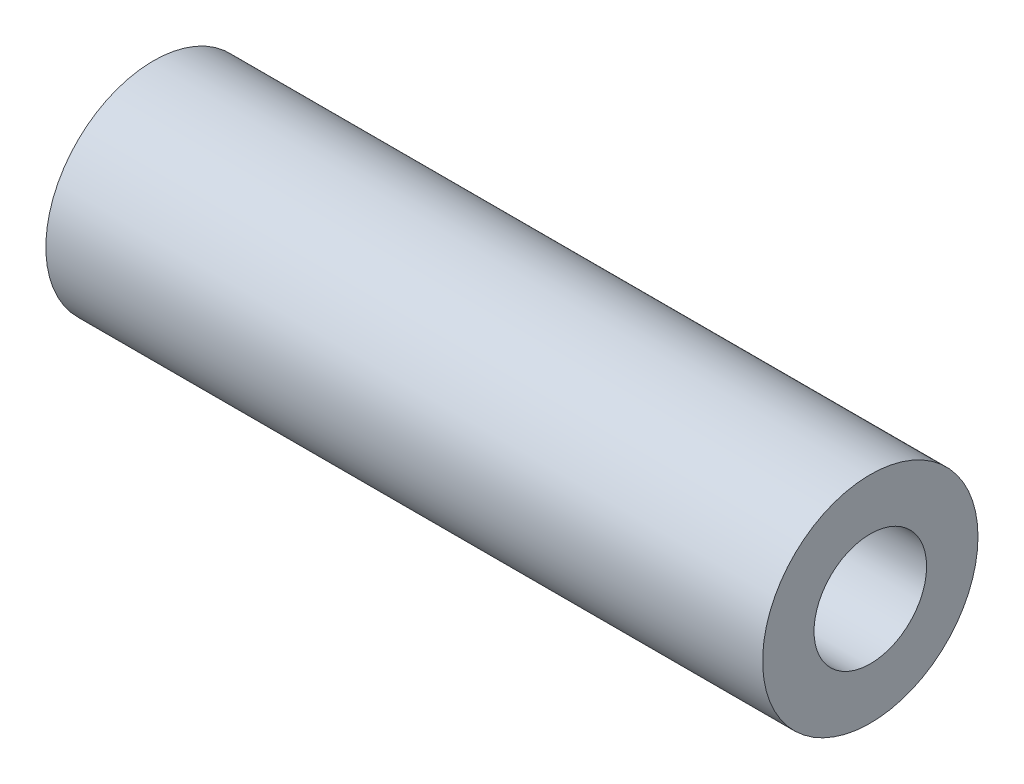
ISO-10303-21;
HEADER;
FILE_DESCRIPTION(('STEP AP214'),'2;1');
FILE_NAME('part.step','',(''),(''),'','','');
FILE_SCHEMA(('AUTOMOTIVE_DESIGN { 1 0 10303 214 1 1 1 1 }'));
ENDSEC;
DATA;
#1=APPLICATION_CONTEXT('core data for automotive mechanical design processes');
#2=APPLICATION_PROTOCOL_DEFINITION('international standard','automotive_design',2000,#1);
#3=PRODUCT_CONTEXT('',#1,'mechanical');
#4=PRODUCT('Part','Part','',(#3));
#5=PRODUCT_RELATED_PRODUCT_CATEGORY('part','',(#4));
#6=PRODUCT_DEFINITION_FORMATION('','',#4);
#7=PRODUCT_DEFINITION_CONTEXT('part definition',#1,'design');
#8=PRODUCT_DEFINITION('design','',#6,#7);
#9=PRODUCT_DEFINITION_SHAPE('','',#8);
#10=(LENGTH_UNIT() NAMED_UNIT(*) SI_UNIT(.MILLI.,.METRE.));
#11=(NAMED_UNIT(*) PLANE_ANGLE_UNIT() SI_UNIT($,.RADIAN.));
#12=(NAMED_UNIT(*) SI_UNIT($,.STERADIAN.) SOLID_ANGLE_UNIT());
#13=UNCERTAINTY_MEASURE_WITH_UNIT(LENGTH_MEASURE(1.E-05),#10,'distance_accuracy_value','');
#14=(GEOMETRIC_REPRESENTATION_CONTEXT(3) GLOBAL_UNCERTAINTY_ASSIGNED_CONTEXT((#13)) GLOBAL_UNIT_ASSIGNED_CONTEXT((#10,
#11,#12)) REPRESENTATION_CONTEXT('',''));
#15=CARTESIAN_POINT('',(0.,0.,0.));
#16=DIRECTION('',(0.,0.,1.));
#17=DIRECTION('',(1.,0.,0.));
#18=AXIS2_PLACEMENT_3D('',#15,#16,#17);
#19=CARTESIAN_POINT('',(15.8496,0.,0.));
#20=DIRECTION('',(1.,0.,0.));
#21=DIRECTION('',(0.,0.,-1.));
#22=AXIS2_PLACEMENT_3D('',#19,#20,#21);
#23=PLANE('',#22);
#24=CARTESIAN_POINT('',(15.8496,0.,0.));
#25=DIRECTION('',(1.,0.,0.));
#26=DIRECTION('',(0.,0.,-1.));
#27=AXIS2_PLACEMENT_3D('',#24,#25,#26);
#28=CIRCLE('',#27,4.7625);
#29=CARTESIAN_POINT('',(15.8496,0.,-4.7625));
#30=VERTEX_POINT('',#29);
#31=EDGE_CURVE('E10',#30,#30,#28,.T.);
#32=ORIENTED_EDGE('',*,*,#31,.T.);
#33=EDGE_LOOP('',(#32));
#34=FACE_BOUND('',#33,.T.);
#35=CARTESIAN_POINT('',(15.8496,0.,0.));
#36=DIRECTION('',(1.,0.,0.));
#37=DIRECTION('',(0.,0.,-1.));
#38=AXIS2_PLACEMENT_3D('',#35,#36,#37);
#39=CIRCLE('',#38,2.4892);
#40=CARTESIAN_POINT('',(15.8496,0.,-2.4892));
#41=VERTEX_POINT('',#40);
#42=EDGE_CURVE('E50',#41,#41,#39,.T.);
#43=ORIENTED_EDGE('',*,*,#42,.F.);
#44=EDGE_LOOP('',(#43));
#45=FACE_BOUND('',#44,.T.);
#46=ADVANCED_FACE('F39',(#34,#45),#23,.T.);
#47=CARTESIAN_POINT('',(-15.8496,0.,0.));
#48=DIRECTION('',(1.,0.,0.));
#49=DIRECTION('',(0.,0.,-1.));
#50=AXIS2_PLACEMENT_3D('',#47,#48,#49);
#51=PLANE('',#50);
#52=CARTESIAN_POINT('',(-15.8496,0.,0.));
#53=DIRECTION('',(1.,0.,0.));
#54=DIRECTION('',(0.,0.,-1.));
#55=AXIS2_PLACEMENT_3D('',#52,#53,#54);
#56=CIRCLE('',#55,4.7625);
#57=CARTESIAN_POINT('',(-15.8496,0.,-4.7625));
#58=VERTEX_POINT('',#57);
#59=EDGE_CURVE('E43',#58,#58,#56,.T.);
#60=ORIENTED_EDGE('',*,*,#59,.F.);
#61=EDGE_LOOP('',(#60));
#62=FACE_BOUND('',#61,.T.);
#63=CARTESIAN_POINT('',(-15.8496,0.,0.));
#64=DIRECTION('',(1.,0.,0.));
#65=DIRECTION('',(0.,0.,-1.));
#66=AXIS2_PLACEMENT_3D('',#63,#64,#65);
#67=CIRCLE('',#66,2.4892);
#68=CARTESIAN_POINT('',(-15.8496,0.,-2.4892));
#69=VERTEX_POINT('',#68);
#70=EDGE_CURVE('E52',#69,#69,#67,.T.);
#71=ORIENTED_EDGE('',*,*,#70,.T.);
#72=EDGE_LOOP('',(#71));
#73=FACE_BOUND('',#72,.T.);
#74=ADVANCED_FACE('F62',(#62,#73),#51,.F.);
#75=CARTESIAN_POINT('',(15.8496,0.,0.));
#76=DIRECTION('',(-1.,0.,0.));
#77=DIRECTION('',(0.,0.,1.));
#78=AXIS2_PLACEMENT_3D('',#75,#76,#77);
#79=CYLINDRICAL_SURFACE('',#78,4.7625);
#80=ORIENTED_EDGE('',*,*,#31,.F.);
#81=EDGE_LOOP('',(#80));
#82=FACE_BOUND('',#81,.T.);
#83=ORIENTED_EDGE('',*,*,#59,.T.);
#84=EDGE_LOOP('',(#83));
#85=FACE_BOUND('',#84,.T.);
#86=ADVANCED_FACE('F41',(#82,#85),#79,.T.);
#87=CARTESIAN_POINT('',(15.8496,0.,0.));
#88=DIRECTION('',(-1.,0.,0.));
#89=DIRECTION('',(0.,0.,1.));
#90=AXIS2_PLACEMENT_3D('',#87,#88,#89);
#91=CYLINDRICAL_SURFACE('',#90,2.4892);
#92=ORIENTED_EDGE('',*,*,#42,.T.);
#93=EDGE_LOOP('',(#92));
#94=FACE_BOUND('',#93,.T.);
#95=ORIENTED_EDGE('',*,*,#70,.F.);
#96=EDGE_LOOP('',(#95));
#97=FACE_BOUND('',#96,.T.);
#98=ADVANCED_FACE('F58',(#94,#97),#91,.F.);
#99=CLOSED_SHELL('',(#46,#74,#86,#98));
#100=MANIFOLD_SOLID_BREP('B2',#99);
#101=ADVANCED_BREP_SHAPE_REPRESENTATION('',(#18,#100),#14);
#102=SHAPE_DEFINITION_REPRESENTATION(#9,#101);
ENDSEC;
END-ISO-10303-21;
